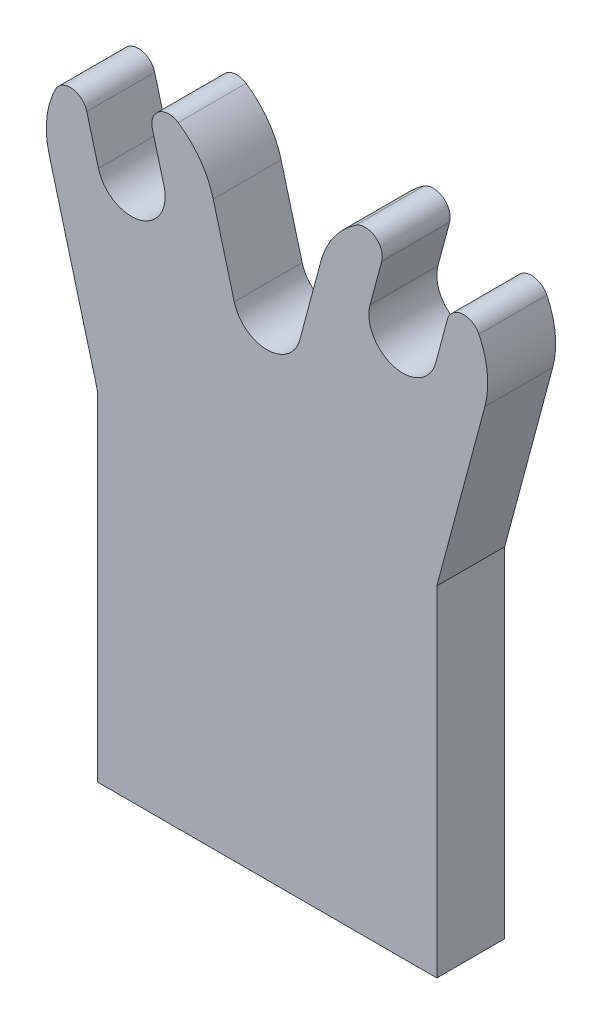
ISO-10303-21;
HEADER;
FILE_DESCRIPTION(('STEP AP214'),'2;1');
FILE_NAME('part.step','',(''),(''),'','','');
FILE_SCHEMA(('AUTOMOTIVE_DESIGN { 1 0 10303 214 1 1 1 1 }'));
ENDSEC;
DATA;
#1=APPLICATION_CONTEXT('core data for automotive mechanical design processes');
#2=APPLICATION_PROTOCOL_DEFINITION('international standard','automotive_design',2000,#1);
#3=PRODUCT_CONTEXT('',#1,'mechanical');
#4=PRODUCT('Part','Part','',(#3));
#5=PRODUCT_RELATED_PRODUCT_CATEGORY('part','',(#4));
#6=PRODUCT_DEFINITION_FORMATION('','',#4);
#7=PRODUCT_DEFINITION_CONTEXT('part definition',#1,'design');
#8=PRODUCT_DEFINITION('design','',#6,#7);
#9=PRODUCT_DEFINITION_SHAPE('','',#8);
#10=(LENGTH_UNIT() NAMED_UNIT(*) SI_UNIT(.MILLI.,.METRE.));
#11=(NAMED_UNIT(*) PLANE_ANGLE_UNIT() SI_UNIT($,.RADIAN.));
#12=(NAMED_UNIT(*) SI_UNIT($,.STERADIAN.) SOLID_ANGLE_UNIT());
#13=UNCERTAINTY_MEASURE_WITH_UNIT(LENGTH_MEASURE(1.E-05),#10,'distance_accuracy_value','');
#14=(GEOMETRIC_REPRESENTATION_CONTEXT(3) GLOBAL_UNCERTAINTY_ASSIGNED_CONTEXT((#13)) GLOBAL_UNIT_ASSIGNED_CONTEXT((#10,
#11,#12)) REPRESENTATION_CONTEXT('',''));
#15=CARTESIAN_POINT('',(0.,0.,0.));
#16=DIRECTION('',(0.,0.,1.));
#17=DIRECTION('',(1.,0.,0.));
#18=AXIS2_PLACEMENT_3D('',#15,#16,#17);
#19=CARTESIAN_POINT('',(4.,10.9272074553216,2.));
#20=DIRECTION('',(0.,0.,-1.));
#21=DIRECTION('',(-1.,0.,0.));
#22=AXIS2_PLACEMENT_3D('',#19,#20,#21);
#23=CYLINDRICAL_SURFACE('',#22,1.);
#24=CARTESIAN_POINT('',(4.,10.9272074553216,0.));
#25=DIRECTION('',(0.,0.,1.));
#26=DIRECTION('',(1.,0.,0.));
#27=AXIS2_PLACEMENT_3D('',#24,#25,#26);
#28=CIRCLE('',#27,1.);
#29=CARTESIAN_POINT('',(3.03407417371093,11.1860265004242,0.));
#30=VERTEX_POINT('',#29);
#31=CARTESIAN_POINT('',(4.96592582628907,10.6683884102191,0.));
#32=VERTEX_POINT('',#31);
#33=EDGE_CURVE('E204',#30,#32,#28,.T.);
#34=ORIENTED_EDGE('',*,*,#33,.F.);
#35=DIRECTION('',(0.,0.,-1.));
#36=VECTOR('',#35,1.);
#37=CARTESIAN_POINT('',(3.03407417371093,11.1860265004242,2.));
#38=LINE('',#37,#36);
#39=CARTESIAN_POINT('',(3.03407417371093,11.1860265004242,2.));
#40=VERTEX_POINT('',#39);
#41=EDGE_CURVE('E190',#40,#30,#38,.T.);
#42=ORIENTED_EDGE('',*,*,#41,.F.);
#43=CARTESIAN_POINT('',(4.,10.9272074553216,2.));
#44=DIRECTION('',(0.,0.,1.));
#45=DIRECTION('',(1.,0.,0.));
#46=AXIS2_PLACEMENT_3D('',#43,#44,#45);
#47=CIRCLE('',#46,1.);
#48=CARTESIAN_POINT('',(4.96592582628907,10.6683884102191,2.));
#49=VERTEX_POINT('',#48);
#50=EDGE_CURVE('E198',#40,#49,#47,.T.);
#51=ORIENTED_EDGE('',*,*,#50,.T.);
#52=DIRECTION('',(0.,0.,-1.));
#53=VECTOR('',#52,1.);
#54=CARTESIAN_POINT('',(4.96592582628907,10.6683884102191,2.));
#55=LINE('',#54,#53);
#56=EDGE_CURVE('E249',#49,#32,#55,.T.);
#57=ORIENTED_EDGE('',*,*,#56,.T.);
#58=EDGE_LOOP('',(#34,#42,#51,#57));
#59=FACE_BOUND('',#58,.T.);
#60=ADVANCED_FACE('F37',(#59),#23,.F.);
#61=CARTESIAN_POINT('',(0.0343231174492896,-0.00919685160225608,2.));
#62=DIRECTION('',(0.965925826289066,-0.25881904510253,0.));
#63=DIRECTION('',(0.25881904510253,0.965925826289066,0.));
#64=AXIS2_PLACEMENT_3D('',#61,#62,#63);
#65=PLANE('',#64);
#66=DIRECTION('',(-0.25881904510253,-0.965925826289066,0.));
#67=VECTOR('',#66,1.);
#68=CARTESIAN_POINT('',(0.0343231174492896,-0.00919685160225608,0.));
#69=LINE('',#68,#67);
#70=CARTESIAN_POINT('',(3.37645958766517,12.4638262610719,0.));
#71=VERTEX_POINT('',#70);
#72=EDGE_CURVE('E251',#71,#30,#69,.T.);
#73=ORIENTED_EDGE('',*,*,#72,.F.);
#74=DIRECTION('',(0.,0.,1.));
#75=VECTOR('',#74,1.);
#76=CARTESIAN_POINT('',(3.37645958766517,12.4638262610719,2.));
#77=LINE('',#76,#75);
#78=CARTESIAN_POINT('',(3.37645958766517,12.4638262610719,2.));
#79=VERTEX_POINT('',#78);
#80=EDGE_CURVE('E193',#71,#79,#77,.T.);
#81=ORIENTED_EDGE('',*,*,#80,.T.);
#82=DIRECTION('',(-0.25881904510253,-0.965925826289066,0.));
#83=VECTOR('',#82,1.);
#84=CARTESIAN_POINT('',(0.0343231174492896,-0.00919685160225608,2.));
#85=LINE('',#84,#83);
#86=EDGE_CURVE('E186',#79,#40,#85,.T.);
#87=ORIENTED_EDGE('',*,*,#86,.T.);
#88=ORIENTED_EDGE('',*,*,#41,.T.);
#89=EDGE_LOOP('',(#73,#81,#87,#88));
#90=FACE_BOUND('',#89,.T.);
#91=ADVANCED_FACE('F189',(#90),#65,.T.);
#92=CARTESIAN_POINT('',(4.,10.9272074553216,2.));
#93=DIRECTION('',(0.,0.,-1.));
#94=DIRECTION('',(-1.,0.,0.));
#95=AXIS2_PLACEMENT_3D('',#92,#93,#94);
#96=CYLINDRICAL_SURFACE('',#95,2.49999999999997);
#97=CARTESIAN_POINT('',(4.,10.9272074553216,2.));
#98=DIRECTION('',(0.,0.,1.));
#99=DIRECTION('',(1.,0.,0.));
#100=AXIS2_PLACEMENT_3D('',#97,#98,#99);
#101=CIRCLE('',#100,2.49999999999997);
#102=CARTESIAN_POINT('',(2.61687084315079,13.0097428656985,2.));
#103=VERTEX_POINT('',#102);
#104=CARTESIAN_POINT('',(1.58518543427737,11.574255068078,2.));
#105=VERTEX_POINT('',#104);
#106=EDGE_CURVE('E197',#103,#105,#101,.T.);
#107=ORIENTED_EDGE('',*,*,#106,.F.);
#108=DIRECTION('',(0.,0.,-1.));
#109=VECTOR('',#108,1.);
#110=CARTESIAN_POINT('',(2.61687084315079,13.0097428656985,2.));
#111=LINE('',#110,#109);
#112=CARTESIAN_POINT('',(2.61687084315079,13.0097428656985,0.));
#113=VERTEX_POINT('',#112);
#114=EDGE_CURVE('E328',#103,#113,#111,.T.);
#115=ORIENTED_EDGE('',*,*,#114,.T.);
#116=CARTESIAN_POINT('',(4.,10.9272074553216,0.));
#117=DIRECTION('',(0.,0.,1.));
#118=DIRECTION('',(1.,0.,0.));
#119=AXIS2_PLACEMENT_3D('',#116,#117,#118);
#120=CIRCLE('',#119,2.49999999999997);
#121=CARTESIAN_POINT('',(1.58518543427737,11.574255068078,0.));
#122=VERTEX_POINT('',#121);
#123=EDGE_CURVE('E253',#113,#122,#120,.T.);
#124=ORIENTED_EDGE('',*,*,#123,.T.);
#125=DIRECTION('',(0.,0.,-1.));
#126=VECTOR('',#125,1.);
#127=CARTESIAN_POINT('',(1.58518543427737,11.574255068078,2.));
#128=LINE('',#127,#126);
#129=EDGE_CURVE('E206',#105,#122,#128,.T.);
#130=ORIENTED_EDGE('',*,*,#129,.F.);
#131=EDGE_LOOP('',(#107,#115,#124,#130));
#132=FACE_BOUND('',#131,.T.);
#133=ADVANCED_FACE('F374',(#132),#96,.T.);
#134=CARTESIAN_POINT('',(-1.41456562198433,0.379031716051551,2.));
#135=DIRECTION('',(0.965925826289065,-0.258819045102534,0.));
#136=DIRECTION('',(0.258819045102534,0.965925826289065,0.));
#137=AXIS2_PLACEMENT_3D('',#134,#135,#136);
#138=PLANE('',#137);
#139=DIRECTION('',(-0.258819045102534,-0.965925826289065,0.));
#140=VECTOR('',#139,1.);
#141=CARTESIAN_POINT('',(-1.41456562198433,0.379031716051551,0.));
#142=LINE('',#141,#140);
#143=CARTESIAN_POINT('',(0.965925826289066,9.26314674799058,0.));
#144=VERTEX_POINT('',#143);
#145=EDGE_CURVE('E255',#122,#144,#142,.T.);
#146=ORIENTED_EDGE('',*,*,#145,.T.);
#147=DIRECTION('',(0.,0.,-1.));
#148=VECTOR('',#147,1.);
#149=CARTESIAN_POINT('',(0.965925826289065,9.26314674799058,2.));
#150=LINE('',#149,#148);
#151=CARTESIAN_POINT('',(0.965925826289066,9.26314674799058,2.));
#152=VERTEX_POINT('',#151);
#153=EDGE_CURVE('E52',#144,#152,#150,.F.);
#154=ORIENTED_EDGE('',*,*,#153,.T.);
#155=DIRECTION('',(-0.258819045102534,-0.965925826289065,0.));
#156=VECTOR('',#155,1.);
#157=CARTESIAN_POINT('',(-1.41456562198433,0.379031716051551,2.));
#158=LINE('',#157,#156);
#159=EDGE_CURVE('E219',#105,#152,#158,.T.);
#160=ORIENTED_EDGE('',*,*,#159,.F.);
#161=ORIENTED_EDGE('',*,*,#129,.T.);
#162=EDGE_LOOP('',(#146,#154,#160,#161));
#163=FACE_BOUND('',#162,.T.);
#164=ADVANCED_FACE('F449',(#163),#138,.F.);
#165=CARTESIAN_POINT('',(1.41456562198433,0.379031716051551,2.));
#166=DIRECTION('',(0.965925826289065,0.258819045102534,0.));
#167=DIRECTION('',(-0.258819045102534,0.965925826289065,0.));
#168=AXIS2_PLACEMENT_3D('',#165,#166,#167);
#169=PLANE('',#168);
#170=DIRECTION('',(0.258819045102534,-0.965925826289065,0.));
#171=VECTOR('',#170,1.);
#172=CARTESIAN_POINT('',(1.41456562198433,0.379031716051551,2.));
#173=LINE('',#172,#171);
#174=CARTESIAN_POINT('',(-1.58518543427737,11.574255068078,2.));
#175=VERTEX_POINT('',#174);
#176=CARTESIAN_POINT('',(-0.965925826289066,9.26314674799059,2.));
#177=VERTEX_POINT('',#176);
#178=EDGE_CURVE('E222',#175,#177,#173,.T.);
#179=ORIENTED_EDGE('',*,*,#178,.T.);
#180=DIRECTION('',(0.,0.,-1.));
#181=VECTOR('',#180,1.);
#182=CARTESIAN_POINT('',(-0.965925826289065,9.26314674799058,2.));
#183=LINE('',#182,#181);
#184=CARTESIAN_POINT('',(-0.965925826289066,9.26314674799059,0.));
#185=VERTEX_POINT('',#184);
#186=EDGE_CURVE('E342',#177,#185,#183,.T.);
#187=ORIENTED_EDGE('',*,*,#186,.T.);
#188=DIRECTION('',(0.258819045102534,-0.965925826289065,0.));
#189=VECTOR('',#188,1.);
#190=CARTESIAN_POINT('',(1.41456562198433,0.379031716051551,0.));
#191=LINE('',#190,#189);
#192=CARTESIAN_POINT('',(-1.58518543427737,11.574255068078,0.));
#193=VERTEX_POINT('',#192);
#194=EDGE_CURVE('E257',#193,#185,#191,.T.);
#195=ORIENTED_EDGE('',*,*,#194,.F.);
#196=DIRECTION('',(0.,0.,-1.));
#197=VECTOR('',#196,1.);
#198=CARTESIAN_POINT('',(-1.58518543427737,11.574255068078,2.));
#199=LINE('',#198,#197);
#200=EDGE_CURVE('E303',#175,#193,#199,.T.);
#201=ORIENTED_EDGE('',*,*,#200,.F.);
#202=EDGE_LOOP('',(#179,#187,#195,#201));
#203=FACE_BOUND('',#202,.T.);
#204=ADVANCED_FACE('F348',(#203),#169,.T.);
#205=CARTESIAN_POINT('',(-4.,10.9272074553216,2.));
#206=DIRECTION('',(0.,0.,-1.));
#207=DIRECTION('',(-1.,0.,0.));
#208=AXIS2_PLACEMENT_3D('',#205,#206,#207);
#209=CYLINDRICAL_SURFACE('',#208,2.49999999999997);
#210=CARTESIAN_POINT('',(-4.,10.9272074553216,0.));
#211=DIRECTION('',(0.,0.,1.));
#212=DIRECTION('',(1.,0.,0.));
#213=AXIS2_PLACEMENT_3D('',#210,#211,#212);
#214=CIRCLE('',#213,2.49999999999997);
#215=CARTESIAN_POINT('',(-2.61687084315079,13.0097428656985,0.));
#216=VERTEX_POINT('',#215);
#217=EDGE_CURVE('E259',#216,#193,#214,.F.);
#218=ORIENTED_EDGE('',*,*,#217,.F.);
#219=DIRECTION('',(0.,0.,-1.));
#220=VECTOR('',#219,1.);
#221=CARTESIAN_POINT('',(-2.61687084315079,13.0097428656985,2.));
#222=LINE('',#221,#220);
#223=CARTESIAN_POINT('',(-2.61687084315079,13.0097428656985,2.));
#224=VERTEX_POINT('',#223);
#225=EDGE_CURVE('E335',#216,#224,#222,.F.);
#226=ORIENTED_EDGE('',*,*,#225,.T.);
#227=CARTESIAN_POINT('',(-4.,10.9272074553216,2.));
#228=DIRECTION('',(0.,0.,1.));
#229=DIRECTION('',(1.,0.,0.));
#230=AXIS2_PLACEMENT_3D('',#227,#228,#229);
#231=CIRCLE('',#230,2.49999999999997);
#232=EDGE_CURVE('E225',#224,#175,#231,.F.);
#233=ORIENTED_EDGE('',*,*,#232,.T.);
#234=ORIENTED_EDGE('',*,*,#200,.T.);
#235=EDGE_LOOP('',(#218,#226,#233,#234));
#236=FACE_BOUND('',#235,.T.);
#237=ADVANCED_FACE('F359',(#236),#209,.T.);
#238=CARTESIAN_POINT('',(-0.0343231174492896,-0.00919685160225608,2.));
#239=DIRECTION('',(0.965925826289066,0.25881904510253,0.));
#240=DIRECTION('',(-0.25881904510253,0.965925826289066,0.));
#241=AXIS2_PLACEMENT_3D('',#238,#239,#240);
#242=PLANE('',#241);
#243=DIRECTION('',(0.25881904510253,-0.965925826289066,0.));
#244=VECTOR('',#243,1.);
#245=CARTESIAN_POINT('',(-0.0343231174492896,-0.00919685160225608,2.));
#246=LINE('',#245,#244);
#247=CARTESIAN_POINT('',(-3.37645958766517,12.4638262610719,2.));
#248=VERTEX_POINT('',#247);
#249=CARTESIAN_POINT('',(-3.03407417371093,11.1860265004242,2.));
#250=VERTEX_POINT('',#249);
#251=EDGE_CURVE('E227',#248,#250,#246,.T.);
#252=ORIENTED_EDGE('',*,*,#251,.F.);
#253=DIRECTION('',(0.,0.,1.));
#254=VECTOR('',#253,1.);
#255=CARTESIAN_POINT('',(-3.37645958766517,12.4638262610719,0.));
#256=LINE('',#255,#254);
#257=CARTESIAN_POINT('',(-3.37645958766517,12.4638262610719,0.));
#258=VERTEX_POINT('',#257);
#259=EDGE_CURVE('E332',#248,#258,#256,.F.);
#260=ORIENTED_EDGE('',*,*,#259,.T.);
#261=DIRECTION('',(0.25881904510253,-0.965925826289066,0.));
#262=VECTOR('',#261,1.);
#263=CARTESIAN_POINT('',(-0.0343231174492896,-0.00919685160225608,0.));
#264=LINE('',#263,#262);
#265=CARTESIAN_POINT('',(-3.03407417371093,11.1860265004242,0.));
#266=VERTEX_POINT('',#265);
#267=EDGE_CURVE('E261',#258,#266,#264,.T.);
#268=ORIENTED_EDGE('',*,*,#267,.T.);
#269=DIRECTION('',(0.,0.,-1.));
#270=VECTOR('',#269,1.);
#271=CARTESIAN_POINT('',(-3.03407417371093,11.1860265004242,2.));
#272=LINE('',#271,#270);
#273=EDGE_CURVE('E300',#250,#266,#272,.T.);
#274=ORIENTED_EDGE('',*,*,#273,.F.);
#275=EDGE_LOOP('',(#252,#260,#268,#274));
#276=FACE_BOUND('',#275,.T.);
#277=ADVANCED_FACE('F394',(#276),#242,.F.);
#278=CARTESIAN_POINT('',(-4.,10.9272074553216,2.));
#279=DIRECTION('',(0.,0.,-1.));
#280=DIRECTION('',(-1.,0.,0.));
#281=AXIS2_PLACEMENT_3D('',#278,#279,#280);
#282=CYLINDRICAL_SURFACE('',#281,1.);
#283=CARTESIAN_POINT('',(-4.,10.9272074553216,0.));
#284=DIRECTION('',(0.,0.,1.));
#285=DIRECTION('',(1.,0.,0.));
#286=AXIS2_PLACEMENT_3D('',#283,#284,#285);
#287=CIRCLE('',#286,1.);
#288=CARTESIAN_POINT('',(-4.96592582628907,10.6683884102191,0.));
#289=VERTEX_POINT('',#288);
#290=EDGE_CURVE('E264',#266,#289,#287,.F.);
#291=ORIENTED_EDGE('',*,*,#290,.T.);
#292=DIRECTION('',(0.,0.,-1.));
#293=VECTOR('',#292,1.);
#294=CARTESIAN_POINT('',(-4.96592582628907,10.6683884102191,2.));
#295=LINE('',#294,#293);
#296=CARTESIAN_POINT('',(-4.96592582628907,10.6683884102191,2.));
#297=VERTEX_POINT('',#296);
#298=EDGE_CURVE('E297',#297,#289,#295,.T.);
#299=ORIENTED_EDGE('',*,*,#298,.F.);
#300=CARTESIAN_POINT('',(-4.,10.9272074553216,2.));
#301=DIRECTION('',(0.,0.,1.));
#302=DIRECTION('',(1.,0.,0.));
#303=AXIS2_PLACEMENT_3D('',#300,#301,#302);
#304=CIRCLE('',#303,1.);
#305=EDGE_CURVE('E230',#250,#297,#304,.F.);
#306=ORIENTED_EDGE('',*,*,#305,.F.);
#307=ORIENTED_EDGE('',*,*,#273,.T.);
#308=EDGE_LOOP('',(#291,#299,#306,#307));
#309=FACE_BOUND('',#308,.T.);
#310=ADVANCED_FACE('F399',(#309),#282,.F.);
#311=CARTESIAN_POINT('',(-1.96617477002742,-0.526834941807316,2.));
#312=DIRECTION('',(0.965925826289066,0.25881904510253,0.));
#313=DIRECTION('',(-0.25881904510253,0.965925826289066,0.));
#314=AXIS2_PLACEMENT_3D('',#311,#312,#313);
#315=PLANE('',#314);
#316=DIRECTION('',(0.25881904510253,-0.965925826289066,0.));
#317=VECTOR('',#316,1.);
#318=CARTESIAN_POINT('',(-1.96617477002742,-0.526834941807316,0.));
#319=LINE('',#318,#317);
#320=CARTESIAN_POINT('',(-5.30831124024331,11.9461881708668,0.));
#321=VERTEX_POINT('',#320);
#322=EDGE_CURVE('E267',#321,#289,#319,.T.);
#323=ORIENTED_EDGE('',*,*,#322,.F.);
#324=DIRECTION('',(0.,0.,-1.));
#325=VECTOR('',#324,1.);
#326=CARTESIAN_POINT('',(-5.30831124024331,11.9461881708668,2.));
#327=LINE('',#326,#325);
#328=CARTESIAN_POINT('',(-5.30831124024331,11.9461881708668,2.));
#329=VERTEX_POINT('',#328);
#330=EDGE_CURVE('E340',#321,#329,#327,.F.);
#331=ORIENTED_EDGE('',*,*,#330,.T.);
#332=DIRECTION('',(0.25881904510253,-0.965925826289066,0.));
#333=VECTOR('',#332,1.);
#334=CARTESIAN_POINT('',(-1.96617477002742,-0.526834941807316,2.));
#335=LINE('',#334,#333);
#336=EDGE_CURVE('E233',#329,#297,#335,.T.);
#337=ORIENTED_EDGE('',*,*,#336,.T.);
#338=ORIENTED_EDGE('',*,*,#298,.T.);
#339=EDGE_LOOP('',(#323,#331,#337,#338));
#340=FACE_BOUND('',#339,.T.);
#341=ADVANCED_FACE('F462',(#340),#315,.T.);
#342=CARTESIAN_POINT('',(-6.41481456572264,10.2801598425653,2.));
#343=VERTEX_POINT('',#342);
#344=CARTESIAN_POINT('',(-6.23909269173481,12.039171446564,2.));
#345=VERTEX_POINT('',#344);
#346=EDGE_CURVE('E228',#343,#345,#231,.F.);
#347=ORIENTED_EDGE('',*,*,#346,.T.);
#348=DIRECTION('',(0.,0.,-1.));
#349=VECTOR('',#348,1.);
#350=CARTESIAN_POINT('',(-6.23909269173481,12.039171446564,2.));
#351=LINE('',#350,#349);
#352=CARTESIAN_POINT('',(-6.23909269173481,12.039171446564,0.));
#353=VERTEX_POINT('',#352);
#354=EDGE_CURVE('E337',#345,#353,#351,.T.);
#355=ORIENTED_EDGE('',*,*,#354,.T.);
#356=CARTESIAN_POINT('',(-6.41481456572264,10.2801598425653,0.));
#357=VERTEX_POINT('',#356);
#358=EDGE_CURVE('E262',#357,#353,#214,.F.);
#359=ORIENTED_EDGE('',*,*,#358,.F.);
#360=DIRECTION('',(0.,0.,-1.));
#361=VECTOR('',#360,1.);
#362=CARTESIAN_POINT('',(-6.41481456572264,10.2801598425653,2.));
#363=LINE('',#362,#361);
#364=EDGE_CURVE('E295',#343,#357,#363,.T.);
#365=ORIENTED_EDGE('',*,*,#364,.F.);
#366=EDGE_LOOP('',(#347,#355,#359,#365));
#367=FACE_BOUND('',#366,.T.);
#368=ADVANCED_FACE('F410',(#367),#209,.T.);
#369=CARTESIAN_POINT('',(-3.41506350946107,-0.9150635094611,2.));
#370=DIRECTION('',(-0.965925826289068,-0.258819045102524,0.));
#371=DIRECTION('',(0.258819045102524,-0.965925826289068,0.));
#372=AXIS2_PLACEMENT_3D('',#369,#370,#371);
#373=PLANE('',#372);
#374=DIRECTION('',(-0.258819045102524,0.965925826289068,0.));
#375=VECTOR('',#374,1.);
#376=CARTESIAN_POINT('',(-3.41506350946107,-0.9150635094611,0.));
#377=LINE('',#376,#375);
#378=CARTESIAN_POINT('',(-5.,5.00000000000001,0.));
#379=VERTEX_POINT('',#378);
#380=EDGE_CURVE('E269',#379,#357,#377,.T.);
#381=ORIENTED_EDGE('',*,*,#380,.F.);
#382=DIRECTION('',(0.,0.,-1.));
#383=VECTOR('',#382,1.);
#384=CARTESIAN_POINT('',(-5.,5.00000000000001,2.));
#385=LINE('',#384,#383);
#386=CARTESIAN_POINT('',(-5.,5.00000000000001,2.));
#387=VERTEX_POINT('',#386);
#388=EDGE_CURVE('E293',#387,#379,#385,.T.);
#389=ORIENTED_EDGE('',*,*,#388,.F.);
#390=DIRECTION('',(-0.258819045102524,0.965925826289068,0.));
#391=VECTOR('',#390,1.);
#392=CARTESIAN_POINT('',(-3.41506350946107,-0.9150635094611,2.));
#393=LINE('',#392,#391);
#394=EDGE_CURVE('E235',#387,#343,#393,.T.);
#395=ORIENTED_EDGE('',*,*,#394,.T.);
#396=ORIENTED_EDGE('',*,*,#364,.T.);
#397=EDGE_LOOP('',(#381,#389,#395,#396));
#398=FACE_BOUND('',#397,.T.);
#399=ADVANCED_FACE('F415',(#398),#373,.T.);
#400=CARTESIAN_POINT('',(-5.,0.,2.));
#401=DIRECTION('',(-1.,0.,0.));
#402=DIRECTION('',(0.,-1.,0.));
#403=AXIS2_PLACEMENT_3D('',#400,#401,#402);
#404=PLANE('',#403);
#405=DIRECTION('',(0.,1.,0.));
#406=VECTOR('',#405,1.);
#407=CARTESIAN_POINT('',(-5.,0.,0.));
#408=LINE('',#407,#406);
#409=CARTESIAN_POINT('',(-5.,-4.99999999999999,0.));
#410=VERTEX_POINT('',#409);
#411=EDGE_CURVE('E272',#410,#379,#408,.T.);
#412=ORIENTED_EDGE('',*,*,#411,.F.);
#413=DIRECTION('',(0.,0.,-1.));
#414=VECTOR('',#413,1.);
#415=CARTESIAN_POINT('',(-5.,-4.99999999999999,2.));
#416=LINE('',#415,#414);
#417=CARTESIAN_POINT('',(-5.,-4.99999999999999,2.));
#418=VERTEX_POINT('',#417);
#419=EDGE_CURVE('E291',#418,#410,#416,.T.);
#420=ORIENTED_EDGE('',*,*,#419,.F.);
#421=DIRECTION('',(0.,1.,0.));
#422=VECTOR('',#421,1.);
#423=CARTESIAN_POINT('',(-5.,0.,2.));
#424=LINE('',#423,#422);
#425=EDGE_CURVE('E238',#418,#387,#424,.T.);
#426=ORIENTED_EDGE('',*,*,#425,.T.);
#427=ORIENTED_EDGE('',*,*,#388,.T.);
#428=EDGE_LOOP('',(#412,#420,#426,#427));
#429=FACE_BOUND('',#428,.T.);
#430=ADVANCED_FACE('F420',(#429),#404,.T.);
#431=CARTESIAN_POINT('',(0.,-4.99999999999999,2.));
#432=DIRECTION('',(0.,-1.,0.));
#433=DIRECTION('',(0.,0.,-1.));
#434=AXIS2_PLACEMENT_3D('',#431,#432,#433);
#435=PLANE('',#434);
#436=DIRECTION('',(-1.,0.,0.));
#437=VECTOR('',#436,1.);
#438=CARTESIAN_POINT('',(0.,-4.99999999999999,0.));
#439=LINE('',#438,#437);
#440=CARTESIAN_POINT('',(5.,-4.99999999999999,0.));
#441=VERTEX_POINT('',#440);
#442=EDGE_CURVE('E275',#441,#410,#439,.T.);
#443=ORIENTED_EDGE('',*,*,#442,.F.);
#444=DIRECTION('',(0.,0.,-1.));
#445=VECTOR('',#444,1.);
#446=CARTESIAN_POINT('',(5.,-4.99999999999999,2.));
#447=LINE('',#446,#445);
#448=CARTESIAN_POINT('',(5.,-4.99999999999999,2.));
#449=VERTEX_POINT('',#448);
#450=EDGE_CURVE('E289',#449,#441,#447,.T.);
#451=ORIENTED_EDGE('',*,*,#450,.F.);
#452=DIRECTION('',(-1.,0.,0.));
#453=VECTOR('',#452,1.);
#454=CARTESIAN_POINT('',(0.,-4.99999999999999,2.));
#455=LINE('',#454,#453);
#456=EDGE_CURVE('E241',#449,#418,#455,.T.);
#457=ORIENTED_EDGE('',*,*,#456,.T.);
#458=ORIENTED_EDGE('',*,*,#419,.T.);
#459=EDGE_LOOP('',(#443,#451,#457,#458));
#460=FACE_BOUND('',#459,.T.);
#461=ADVANCED_FACE('F423',(#460),#435,.T.);
#462=CARTESIAN_POINT('',(5.,0.,2.));
#463=DIRECTION('',(-1.,0.,0.));
#464=DIRECTION('',(0.,-1.,0.));
#465=AXIS2_PLACEMENT_3D('',#462,#463,#464);
#466=PLANE('',#465);
#467=DIRECTION('',(0.,1.,0.));
#468=VECTOR('',#467,1.);
#469=CARTESIAN_POINT('',(5.,0.,0.));
#470=LINE('',#469,#468);
#471=CARTESIAN_POINT('',(5.,5.00000000000001,0.));
#472=VERTEX_POINT('',#471);
#473=EDGE_CURVE('E278',#441,#472,#470,.T.);
#474=ORIENTED_EDGE('',*,*,#473,.T.);
#475=DIRECTION('',(0.,0.,-1.));
#476=VECTOR('',#475,1.);
#477=CARTESIAN_POINT('',(5.,5.00000000000001,2.));
#478=LINE('',#477,#476);
#479=CARTESIAN_POINT('',(5.,5.00000000000001,2.));
#480=VERTEX_POINT('',#479);
#481=EDGE_CURVE('E286',#480,#472,#478,.T.);
#482=ORIENTED_EDGE('',*,*,#481,.F.);
#483=DIRECTION('',(0.,1.,0.));
#484=VECTOR('',#483,1.);
#485=CARTESIAN_POINT('',(5.,0.,2.));
#486=LINE('',#485,#484);
#487=EDGE_CURVE('E244',#449,#480,#486,.T.);
#488=ORIENTED_EDGE('',*,*,#487,.F.);
#489=ORIENTED_EDGE('',*,*,#450,.T.);
#490=EDGE_LOOP('',(#474,#482,#488,#489));
#491=FACE_BOUND('',#490,.T.);
#492=ADVANCED_FACE('F429',(#491),#466,.F.);
#493=CARTESIAN_POINT('',(3.41506350946107,-0.9150635094611,2.));
#494=DIRECTION('',(-0.965925826289068,0.258819045102524,0.));
#495=DIRECTION('',(-0.258819045102524,-0.965925826289068,0.));
#496=AXIS2_PLACEMENT_3D('',#493,#494,#495);
#497=PLANE('',#496);
#498=DIRECTION('',(0.258819045102524,0.965925826289068,0.));
#499=VECTOR('',#498,1.);
#500=CARTESIAN_POINT('',(3.41506350946107,-0.9150635094611,0.));
#501=LINE('',#500,#499);
#502=CARTESIAN_POINT('',(6.41481456572264,10.2801598425653,0.));
#503=VERTEX_POINT('',#502);
#504=EDGE_CURVE('E280',#472,#503,#501,.T.);
#505=ORIENTED_EDGE('',*,*,#504,.T.);
#506=DIRECTION('',(0.,0.,-1.));
#507=VECTOR('',#506,1.);
#508=CARTESIAN_POINT('',(6.41481456572264,10.2801598425653,2.));
#509=LINE('',#508,#507);
#510=CARTESIAN_POINT('',(6.41481456572264,10.2801598425653,2.));
#511=VERTEX_POINT('',#510);
#512=EDGE_CURVE('E283',#511,#503,#509,.T.);
#513=ORIENTED_EDGE('',*,*,#512,.F.);
#514=DIRECTION('',(0.258819045102524,0.965925826289068,0.));
#515=VECTOR('',#514,1.);
#516=CARTESIAN_POINT('',(3.41506350946107,-0.9150635094611,2.));
#517=LINE('',#516,#515);
#518=EDGE_CURVE('E246',#480,#511,#517,.T.);
#519=ORIENTED_EDGE('',*,*,#518,.F.);
#520=ORIENTED_EDGE('',*,*,#481,.T.);
#521=EDGE_LOOP('',(#505,#513,#519,#520));
#522=FACE_BOUND('',#521,.T.);
#523=ADVANCED_FACE('F433',(#522),#497,.F.);
#524=CARTESIAN_POINT('',(6.23909269173481,12.039171446564,0.));
#525=VERTEX_POINT('',#524);
#526=EDGE_CURVE('E215',#503,#525,#120,.T.);
#527=ORIENTED_EDGE('',*,*,#526,.T.);
#528=DIRECTION('',(0.,0.,-1.));
#529=VECTOR('',#528,1.);
#530=CARTESIAN_POINT('',(6.23909269173481,12.039171446564,2.));
#531=LINE('',#530,#529);
#532=CARTESIAN_POINT('',(6.23909269173481,12.039171446564,2.));
#533=VERTEX_POINT('',#532);
#534=EDGE_CURVE('E318',#525,#533,#531,.F.);
#535=ORIENTED_EDGE('',*,*,#534,.T.);
#536=EDGE_CURVE('E220',#511,#533,#101,.T.);
#537=ORIENTED_EDGE('',*,*,#536,.F.);
#538=ORIENTED_EDGE('',*,*,#512,.T.);
#539=EDGE_LOOP('',(#527,#535,#537,#538));
#540=FACE_BOUND('',#539,.T.);
#541=ADVANCED_FACE('F438',(#540),#96,.T.);
#542=CARTESIAN_POINT('',(1.96617477002742,-0.526834941807316,2.));
#543=DIRECTION('',(0.965925826289066,-0.25881904510253,0.));
#544=DIRECTION('',(0.25881904510253,0.965925826289066,0.));
#545=AXIS2_PLACEMENT_3D('',#542,#543,#544);
#546=PLANE('',#545);
#547=DIRECTION('',(-0.25881904510253,-0.965925826289066,0.));
#548=VECTOR('',#547,1.);
#549=CARTESIAN_POINT('',(1.96617477002742,-0.526834941807316,2.));
#550=LINE('',#549,#548);
#551=CARTESIAN_POINT('',(5.30831124024331,11.9461881708668,2.));
#552=VERTEX_POINT('',#551);
#553=EDGE_CURVE('E211',#552,#49,#550,.T.);
#554=ORIENTED_EDGE('',*,*,#553,.F.);
#555=DIRECTION('',(0.,0.,-1.));
#556=VECTOR('',#555,1.);
#557=CARTESIAN_POINT('',(5.30831124024331,11.9461881708668,2.));
#558=LINE('',#557,#556);
#559=CARTESIAN_POINT('',(5.30831124024331,11.9461881708668,0.));
#560=VERTEX_POINT('',#559);
#561=EDGE_CURVE('E205',#552,#560,#558,.T.);
#562=ORIENTED_EDGE('',*,*,#561,.T.);
#563=DIRECTION('',(-0.25881904510253,-0.965925826289066,0.));
#564=VECTOR('',#563,1.);
#565=CARTESIAN_POINT('',(1.96617477002742,-0.526834941807316,0.));
#566=LINE('',#565,#564);
#567=EDGE_CURVE('E213',#560,#32,#566,.T.);
#568=ORIENTED_EDGE('',*,*,#567,.T.);
#569=ORIENTED_EDGE('',*,*,#56,.F.);
#570=EDGE_LOOP('',(#554,#562,#568,#569));
#571=FACE_BOUND('',#570,.T.);
#572=ADVANCED_FACE('F443',(#571),#546,.F.);
#573=CARTESIAN_POINT('',(0.,0.,2.));
#574=DIRECTION('',(0.,0.,1.));
#575=DIRECTION('',(1.,0.,0.));
#576=AXIS2_PLACEMENT_3D('',#573,#574,#575);
#577=PLANE('',#576);
#578=ORIENTED_EDGE('',*,*,#536,.T.);
#579=CARTESIAN_POINT('',(5.79127415338784,11.8167786483155,2.));
#580=DIRECTION('',(0.,0.,1.));
#581=DIRECTION('',(1.,0.,0.));
#582=AXIS2_PLACEMENT_3D('',#579,#580,#581);
#583=CIRCLE('',#582,0.5);
#584=EDGE_CURVE('E326',#533,#552,#583,.T.);
#585=ORIENTED_EDGE('',*,*,#584,.T.);
#586=ORIENTED_EDGE('',*,*,#553,.T.);
#587=ORIENTED_EDGE('',*,*,#50,.F.);
#588=ORIENTED_EDGE('',*,*,#86,.F.);
#589=CARTESIAN_POINT('',(2.89349667452064,12.5932357836231,2.));
#590=DIRECTION('',(0.,0.,1.));
#591=DIRECTION('',(1.,0.,0.));
#592=AXIS2_PLACEMENT_3D('',#589,#590,#591);
#593=CIRCLE('',#592,0.5);
#594=EDGE_CURVE('E324',#79,#103,#593,.T.);
#595=ORIENTED_EDGE('',*,*,#594,.T.);
#596=ORIENTED_EDGE('',*,*,#106,.T.);
#597=ORIENTED_EDGE('',*,*,#159,.T.);
#598=CARTESIAN_POINT('',(0.,9.52196579309312,2.));
#599=DIRECTION('',(0.,0.,1.));
#600=DIRECTION('',(1.,0.,0.));
#601=AXIS2_PLACEMENT_3D('',#598,#599,#600);
#602=CIRCLE('',#601,1.);
#603=EDGE_CURVE('E11',#152,#177,#602,.F.);
#604=ORIENTED_EDGE('',*,*,#603,.T.);
#605=ORIENTED_EDGE('',*,*,#178,.F.);
#606=ORIENTED_EDGE('',*,*,#232,.F.);
#607=CARTESIAN_POINT('',(-2.89349667452064,12.5932357836231,2.));
#608=DIRECTION('',(0.,0.,1.));
#609=DIRECTION('',(1.,0.,0.));
#610=AXIS2_PLACEMENT_3D('',#607,#608,#609);
#611=CIRCLE('',#610,0.5);
#612=EDGE_CURVE('E322',#224,#248,#611,.T.);
#613=ORIENTED_EDGE('',*,*,#612,.T.);
#614=ORIENTED_EDGE('',*,*,#251,.T.);
#615=ORIENTED_EDGE('',*,*,#305,.T.);
#616=ORIENTED_EDGE('',*,*,#336,.F.);
#617=CARTESIAN_POINT('',(-5.79127415338784,11.8167786483155,2.));
#618=DIRECTION('',(0.,0.,1.));
#619=DIRECTION('',(1.,0.,0.));
#620=AXIS2_PLACEMENT_3D('',#617,#618,#619);
#621=CIRCLE('',#620,0.5);
#622=EDGE_CURVE('E320',#329,#345,#621,.T.);
#623=ORIENTED_EDGE('',*,*,#622,.T.);
#624=ORIENTED_EDGE('',*,*,#346,.F.);
#625=ORIENTED_EDGE('',*,*,#394,.F.);
#626=ORIENTED_EDGE('',*,*,#425,.F.);
#627=ORIENTED_EDGE('',*,*,#456,.F.);
#628=ORIENTED_EDGE('',*,*,#487,.T.);
#629=ORIENTED_EDGE('',*,*,#518,.T.);
#630=EDGE_LOOP('',(#578,#585,#586,#587,#588,#595,#596,#597,#604,#605,#606,#613,#614,#615,#616,
#623,#624,#625,#626,#627,#628,#629));
#631=FACE_BOUND('',#630,.T.);
#632=ADVANCED_FACE('F209',(#631),#577,.T.);
#633=CARTESIAN_POINT('',(0.,0.,0.));
#634=DIRECTION('',(0.,0.,1.));
#635=DIRECTION('',(1.,0.,0.));
#636=AXIS2_PLACEMENT_3D('',#633,#634,#635);
#637=PLANE('',#636);
#638=ORIENTED_EDGE('',*,*,#567,.F.);
#639=CARTESIAN_POINT('',(5.79127415338784,11.8167786483155,0.));
#640=DIRECTION('',(0.,0.,1.));
#641=DIRECTION('',(1.,0.,0.));
#642=AXIS2_PLACEMENT_3D('',#639,#640,#641);
#643=CIRCLE('',#642,0.5);
#644=EDGE_CURVE('E316',#560,#525,#643,.F.);
#645=ORIENTED_EDGE('',*,*,#644,.T.);
#646=ORIENTED_EDGE('',*,*,#526,.F.);
#647=ORIENTED_EDGE('',*,*,#504,.F.);
#648=ORIENTED_EDGE('',*,*,#473,.F.);
#649=ORIENTED_EDGE('',*,*,#442,.T.);
#650=ORIENTED_EDGE('',*,*,#411,.T.);
#651=ORIENTED_EDGE('',*,*,#380,.T.);
#652=ORIENTED_EDGE('',*,*,#358,.T.);
#653=CARTESIAN_POINT('',(-5.79127415338784,11.8167786483155,0.));
#654=DIRECTION('',(0.,0.,1.));
#655=DIRECTION('',(1.,0.,0.));
#656=AXIS2_PLACEMENT_3D('',#653,#654,#655);
#657=CIRCLE('',#656,0.5);
#658=EDGE_CURVE('E310',#353,#321,#657,.F.);
#659=ORIENTED_EDGE('',*,*,#658,.T.);
#660=ORIENTED_EDGE('',*,*,#322,.T.);
#661=ORIENTED_EDGE('',*,*,#290,.F.);
#662=ORIENTED_EDGE('',*,*,#267,.F.);
#663=CARTESIAN_POINT('',(-2.89349667452064,12.5932357836231,0.));
#664=DIRECTION('',(0.,0.,1.));
#665=DIRECTION('',(1.,0.,0.));
#666=AXIS2_PLACEMENT_3D('',#663,#664,#665);
#667=CIRCLE('',#666,0.5);
#668=EDGE_CURVE('E312',#258,#216,#667,.F.);
#669=ORIENTED_EDGE('',*,*,#668,.T.);
#670=ORIENTED_EDGE('',*,*,#217,.T.);
#671=ORIENTED_EDGE('',*,*,#194,.T.);
#672=CARTESIAN_POINT('',(0.,9.52196579309312,0.));
#673=DIRECTION('',(0.,0.,1.));
#674=DIRECTION('',(1.,0.,0.));
#675=AXIS2_PLACEMENT_3D('',#672,#673,#674);
#676=CIRCLE('',#675,1.);
#677=EDGE_CURVE('E45',#185,#144,#676,.T.);
#678=ORIENTED_EDGE('',*,*,#677,.T.);
#679=ORIENTED_EDGE('',*,*,#145,.F.);
#680=ORIENTED_EDGE('',*,*,#123,.F.);
#681=CARTESIAN_POINT('',(2.89349667452064,12.5932357836231,0.));
#682=DIRECTION('',(0.,0.,1.));
#683=DIRECTION('',(1.,0.,0.));
#684=AXIS2_PLACEMENT_3D('',#681,#682,#683);
#685=CIRCLE('',#684,0.5);
#686=EDGE_CURVE('E314',#113,#71,#685,.F.);
#687=ORIENTED_EDGE('',*,*,#686,.T.);
#688=ORIENTED_EDGE('',*,*,#72,.T.);
#689=ORIENTED_EDGE('',*,*,#33,.T.);
#690=EDGE_LOOP('',(#638,#645,#646,#647,#648,#649,#650,#651,#652,#659,#660,#661,#662,#669,#670,
#671,#678,#679,#680,#687,#688,#689));
#691=FACE_BOUND('',#690,.T.);
#692=ADVANCED_FACE('F354',(#691),#637,.F.);
#693=CARTESIAN_POINT('',(5.79127415338784,11.8167786483155,2.));
#694=DIRECTION('',(0.,0.,-1.));
#695=DIRECTION('',(-1.,0.,0.));
#696=AXIS2_PLACEMENT_3D('',#693,#694,#695);
#697=CYLINDRICAL_SURFACE('',#696,0.5);
#698=ORIENTED_EDGE('',*,*,#584,.F.);
#699=ORIENTED_EDGE('',*,*,#534,.F.);
#700=ORIENTED_EDGE('',*,*,#644,.F.);
#701=ORIENTED_EDGE('',*,*,#561,.F.);
#702=EDGE_LOOP('',(#698,#699,#700,#701));
#703=FACE_BOUND('',#702,.T.);
#704=ADVANCED_FACE('F378',(#703),#697,.T.);
#705=CARTESIAN_POINT('',(2.89349667452064,12.5932357836231,2.));
#706=DIRECTION('',(0.,0.,-1.));
#707=DIRECTION('',(-1.,0.,0.));
#708=AXIS2_PLACEMENT_3D('',#705,#706,#707);
#709=CYLINDRICAL_SURFACE('',#708,0.5);
#710=ORIENTED_EDGE('',*,*,#594,.F.);
#711=ORIENTED_EDGE('',*,*,#80,.F.);
#712=ORIENTED_EDGE('',*,*,#686,.F.);
#713=ORIENTED_EDGE('',*,*,#114,.F.);
#714=EDGE_LOOP('',(#710,#711,#712,#713));
#715=FACE_BOUND('',#714,.T.);
#716=ADVANCED_FACE('F381',(#715),#709,.T.);
#717=CARTESIAN_POINT('',(-2.89349667452064,12.5932357836231,2.));
#718=DIRECTION('',(0.,0.,-1.));
#719=DIRECTION('',(-1.,0.,0.));
#720=AXIS2_PLACEMENT_3D('',#717,#718,#719);
#721=CYLINDRICAL_SURFACE('',#720,0.5);
#722=ORIENTED_EDGE('',*,*,#612,.F.);
#723=ORIENTED_EDGE('',*,*,#225,.F.);
#724=ORIENTED_EDGE('',*,*,#668,.F.);
#725=ORIENTED_EDGE('',*,*,#259,.F.);
#726=EDGE_LOOP('',(#722,#723,#724,#725));
#727=FACE_BOUND('',#726,.T.);
#728=ADVANCED_FACE('F367',(#727),#721,.T.);
#729=CARTESIAN_POINT('',(-5.79127415338784,11.8167786483155,2.));
#730=DIRECTION('',(0.,0.,-1.));
#731=DIRECTION('',(-1.,0.,0.));
#732=AXIS2_PLACEMENT_3D('',#729,#730,#731);
#733=CYLINDRICAL_SURFACE('',#732,0.5);
#734=ORIENTED_EDGE('',*,*,#622,.F.);
#735=ORIENTED_EDGE('',*,*,#330,.F.);
#736=ORIENTED_EDGE('',*,*,#658,.F.);
#737=ORIENTED_EDGE('',*,*,#354,.F.);
#738=EDGE_LOOP('',(#734,#735,#736,#737));
#739=FACE_BOUND('',#738,.T.);
#740=ADVANCED_FACE('F363',(#739),#733,.T.);
#741=CARTESIAN_POINT('',(0.,9.52196579309312,2.));
#742=DIRECTION('',(0.,0.,-1.));
#743=DIRECTION('',(-1.,0.,0.));
#744=AXIS2_PLACEMENT_3D('',#741,#742,#743);
#745=CYLINDRICAL_SURFACE('',#744,1.);
#746=ORIENTED_EDGE('',*,*,#603,.F.);
#747=ORIENTED_EDGE('',*,*,#153,.F.);
#748=ORIENTED_EDGE('',*,*,#677,.F.);
#749=ORIENTED_EDGE('',*,*,#186,.F.);
#750=EDGE_LOOP('',(#746,#747,#748,#749));
#751=FACE_BOUND('',#750,.T.);
#752=ADVANCED_FACE('F39',(#751),#745,.F.);
#753=CLOSED_SHELL('',(#60,#91,#133,#164,#204,#237,#277,#310,#341,#368,#399,#430,#461,#492,#523,
#541,#572,#632,#692,#704,#716,#728,#740,#752));
#754=MANIFOLD_SOLID_BREP('B2',#753);
#755=ADVANCED_BREP_SHAPE_REPRESENTATION('',(#18,#754),#14);
#756=SHAPE_DEFINITION_REPRESENTATION(#9,#755);
ENDSEC;
END-ISO-10303-21;
